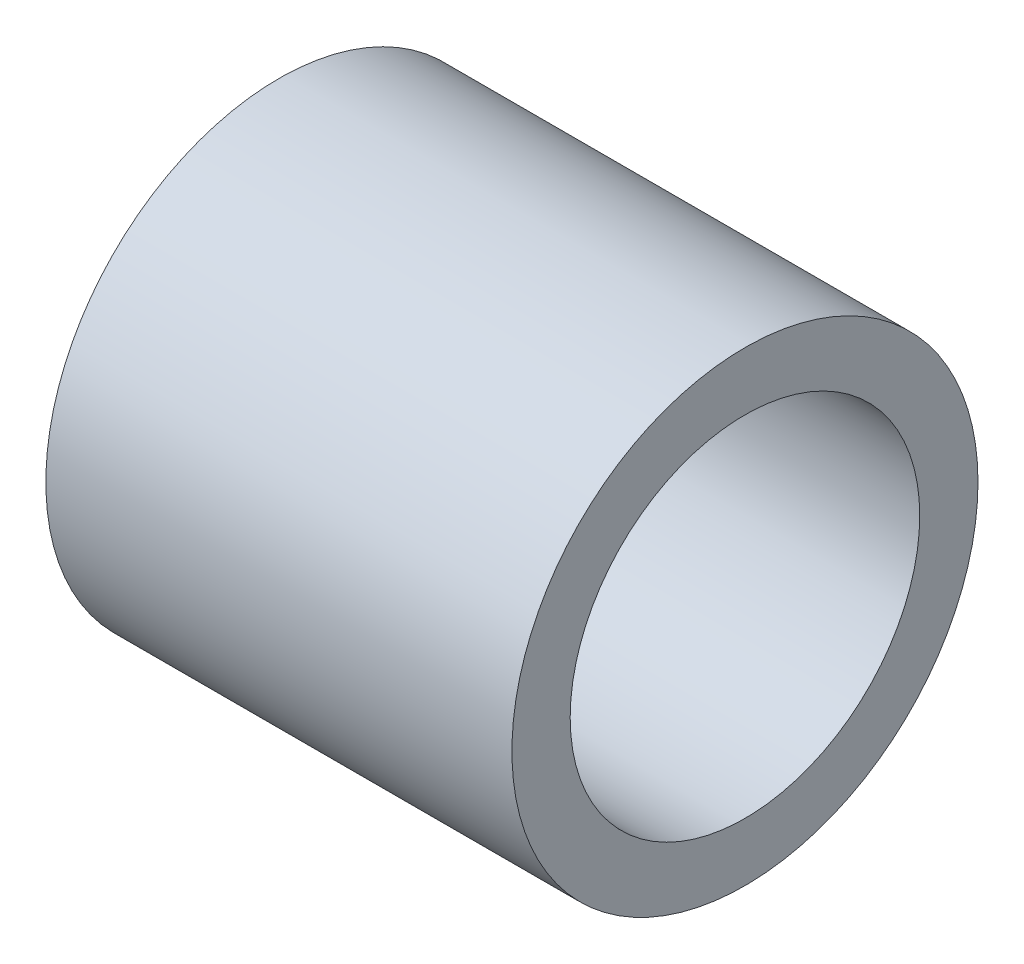
ISO-10303-21;
HEADER;
FILE_DESCRIPTION(('STEP AP214'),'2;1');
FILE_NAME('part.step','',(''),(''),'','','');
FILE_SCHEMA(('AUTOMOTIVE_DESIGN { 1 0 10303 214 1 1 1 1 }'));
ENDSEC;
DATA;
#1=APPLICATION_CONTEXT('core data for automotive mechanical design processes');
#2=APPLICATION_PROTOCOL_DEFINITION('international standard','automotive_design',2000,#1);
#3=PRODUCT_CONTEXT('',#1,'mechanical');
#4=PRODUCT('Part','Part','',(#3));
#5=PRODUCT_RELATED_PRODUCT_CATEGORY('part','',(#4));
#6=PRODUCT_DEFINITION_FORMATION('','',#4);
#7=PRODUCT_DEFINITION_CONTEXT('part definition',#1,'design');
#8=PRODUCT_DEFINITION('design','',#6,#7);
#9=PRODUCT_DEFINITION_SHAPE('','',#8);
#10=(LENGTH_UNIT() NAMED_UNIT(*) SI_UNIT(.MILLI.,.METRE.));
#11=(NAMED_UNIT(*) PLANE_ANGLE_UNIT() SI_UNIT($,.RADIAN.));
#12=(NAMED_UNIT(*) SI_UNIT($,.STERADIAN.) SOLID_ANGLE_UNIT());
#13=UNCERTAINTY_MEASURE_WITH_UNIT(LENGTH_MEASURE(1.E-05),#10,'distance_accuracy_value','');
#14=(GEOMETRIC_REPRESENTATION_CONTEXT(3) GLOBAL_UNCERTAINTY_ASSIGNED_CONTEXT((#13)) GLOBAL_UNIT_ASSIGNED_CONTEXT((#10,
#11,#12)) REPRESENTATION_CONTEXT('',''));
#15=CARTESIAN_POINT('',(0.,0.,0.));
#16=DIRECTION('',(0.,0.,1.));
#17=DIRECTION('',(1.,0.,0.));
#18=AXIS2_PLACEMENT_3D('',#15,#16,#17);
#19=CARTESIAN_POINT('',(12.7,0.,0.));
#20=DIRECTION('',(1.,0.,0.));
#21=DIRECTION('',(0.,0.,-1.));
#22=AXIS2_PLACEMENT_3D('',#19,#20,#21);
#23=PLANE('',#22);
#24=CARTESIAN_POINT('',(12.7,0.,0.));
#25=DIRECTION('',(1.,0.,0.));
#26=DIRECTION('',(0.,0.,-1.));
#27=AXIS2_PLACEMENT_3D('',#24,#25,#26);
#28=CIRCLE('',#27,12.7);
#29=CARTESIAN_POINT('',(12.7,0.,-12.7));
#30=VERTEX_POINT('',#29);
#31=EDGE_CURVE('E10',#30,#30,#28,.T.);
#32=ORIENTED_EDGE('',*,*,#31,.T.);
#33=EDGE_LOOP('',(#32));
#34=FACE_BOUND('',#33,.T.);
#35=CARTESIAN_POINT('',(12.7,0.,0.));
#36=DIRECTION('',(1.,0.,0.));
#37=DIRECTION('',(0.,0.,-1.));
#38=AXIS2_PLACEMENT_3D('',#35,#36,#37);
#39=CIRCLE('',#38,9.525);
#40=CARTESIAN_POINT('',(12.7,0.,-9.525));
#41=VERTEX_POINT('',#40);
#42=EDGE_CURVE('E50',#41,#41,#39,.T.);
#43=ORIENTED_EDGE('',*,*,#42,.F.);
#44=EDGE_LOOP('',(#43));
#45=FACE_BOUND('',#44,.T.);
#46=ADVANCED_FACE('F37',(#34,#45),#23,.T.);
#47=CARTESIAN_POINT('',(-12.7,0.,0.));
#48=DIRECTION('',(1.,0.,0.));
#49=DIRECTION('',(0.,0.,-1.));
#50=AXIS2_PLACEMENT_3D('',#47,#48,#49);
#51=PLANE('',#50);
#52=CARTESIAN_POINT('',(-12.7,0.,0.));
#53=DIRECTION('',(1.,0.,0.));
#54=DIRECTION('',(0.,0.,-1.));
#55=AXIS2_PLACEMENT_3D('',#52,#53,#54);
#56=CIRCLE('',#55,12.7);
#57=CARTESIAN_POINT('',(-12.7,0.,-12.7));
#58=VERTEX_POINT('',#57);
#59=EDGE_CURVE('E41',#58,#58,#56,.T.);
#60=ORIENTED_EDGE('',*,*,#59,.F.);
#61=EDGE_LOOP('',(#60));
#62=FACE_BOUND('',#61,.T.);
#63=CARTESIAN_POINT('',(-12.7,0.,0.));
#64=DIRECTION('',(1.,0.,0.));
#65=DIRECTION('',(0.,0.,-1.));
#66=AXIS2_PLACEMENT_3D('',#63,#64,#65);
#67=CIRCLE('',#66,9.525);
#68=CARTESIAN_POINT('',(-12.7,0.,-9.525));
#69=VERTEX_POINT('',#68);
#70=EDGE_CURVE('E52',#69,#69,#67,.T.);
#71=ORIENTED_EDGE('',*,*,#70,.T.);
#72=EDGE_LOOP('',(#71));
#73=FACE_BOUND('',#72,.T.);
#74=ADVANCED_FACE('F64',(#62,#73),#51,.F.);
#75=CARTESIAN_POINT('',(12.7,0.,0.));
#76=DIRECTION('',(-1.,0.,0.));
#77=DIRECTION('',(0.,0.,1.));
#78=AXIS2_PLACEMENT_3D('',#75,#76,#77);
#79=CYLINDRICAL_SURFACE('',#78,12.7);
#80=ORIENTED_EDGE('',*,*,#31,.F.);
#81=EDGE_LOOP('',(#80));
#82=FACE_BOUND('',#81,.T.);
#83=ORIENTED_EDGE('',*,*,#59,.T.);
#84=EDGE_LOOP('',(#83));
#85=FACE_BOUND('',#84,.T.);
#86=ADVANCED_FACE('F39',(#82,#85),#79,.T.);
#87=CARTESIAN_POINT('',(12.7,0.,0.));
#88=DIRECTION('',(-1.,0.,0.));
#89=DIRECTION('',(0.,0.,1.));
#90=AXIS2_PLACEMENT_3D('',#87,#88,#89);
#91=CYLINDRICAL_SURFACE('',#90,9.525);
#92=ORIENTED_EDGE('',*,*,#42,.T.);
#93=EDGE_LOOP('',(#92));
#94=FACE_BOUND('',#93,.T.);
#95=ORIENTED_EDGE('',*,*,#70,.F.);
#96=EDGE_LOOP('',(#95));
#97=FACE_BOUND('',#96,.T.);
#98=ADVANCED_FACE('F60',(#94,#97),#91,.F.);
#99=CLOSED_SHELL('',(#46,#74,#86,#98));
#100=MANIFOLD_SOLID_BREP('B2',#99);
#101=ADVANCED_BREP_SHAPE_REPRESENTATION('',(#18,#100),#14);
#102=SHAPE_DEFINITION_REPRESENTATION(#9,#101);
ENDSEC;
END-ISO-10303-21;
